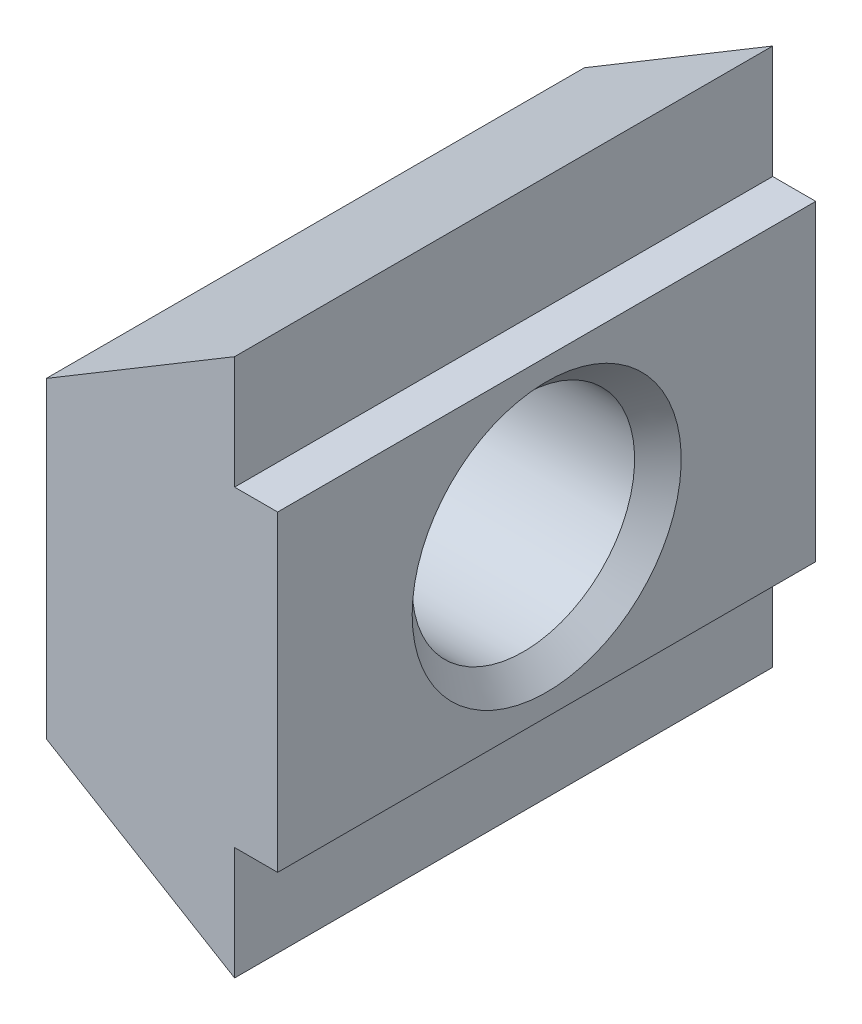
ISO-10303-21;
HEADER;
FILE_DESCRIPTION(('STEP AP214'),'2;1');
FILE_NAME('part.step','',(''),(''),'','','');
FILE_SCHEMA(('AUTOMOTIVE_DESIGN { 1 0 10303 214 1 1 1 1 }'));
ENDSEC;
DATA;
#1=APPLICATION_CONTEXT('core data for automotive mechanical design processes');
#2=APPLICATION_PROTOCOL_DEFINITION('international standard','automotive_design',2000,#1);
#3=PRODUCT_CONTEXT('',#1,'mechanical');
#4=PRODUCT('Part','Part','',(#3));
#5=PRODUCT_RELATED_PRODUCT_CATEGORY('part','',(#4));
#6=PRODUCT_DEFINITION_FORMATION('','',#4);
#7=PRODUCT_DEFINITION_CONTEXT('part definition',#1,'design');
#8=PRODUCT_DEFINITION('design','',#6,#7);
#9=PRODUCT_DEFINITION_SHAPE('','',#8);
#10=(LENGTH_UNIT() NAMED_UNIT(*) SI_UNIT(.MILLI.,.METRE.));
#11=(NAMED_UNIT(*) PLANE_ANGLE_UNIT() SI_UNIT($,.RADIAN.));
#12=(NAMED_UNIT(*) SI_UNIT($,.STERADIAN.) SOLID_ANGLE_UNIT());
#13=UNCERTAINTY_MEASURE_WITH_UNIT(LENGTH_MEASURE(1.E-05),#10,'distance_accuracy_value','');
#14=(GEOMETRIC_REPRESENTATION_CONTEXT(3) GLOBAL_UNCERTAINTY_ASSIGNED_CONTEXT((#13)) GLOBAL_UNIT_ASSIGNED_CONTEXT((#10,
#11,#12)) REPRESENTATION_CONTEXT('',''));
#15=CARTESIAN_POINT('',(0.,0.,0.));
#16=DIRECTION('',(0.,0.,1.));
#17=DIRECTION('',(1.,0.,0.));
#18=AXIS2_PLACEMENT_3D('',#15,#16,#17);
#19=CARTESIAN_POINT('',(-4.3,2.9,5.));
#20=DIRECTION('',(1.,0.,0.));
#21=DIRECTION('',(0.,0.,-1.));
#22=AXIS2_PLACEMENT_3D('',#19,#20,#21);
#23=PLANE('',#22);
#24=DIRECTION('',(0.,0.,-1.));
#25=VECTOR('',#24,1.);
#26=CARTESIAN_POINT('',(-4.3,2.9,5.));
#27=LINE('',#26,#25);
#28=CARTESIAN_POINT('',(-4.3,2.9,5.));
#29=VERTEX_POINT('',#28);
#30=CARTESIAN_POINT('',(-4.3,2.9,-5.));
#31=VERTEX_POINT('',#30);
#32=EDGE_CURVE('E11',#29,#31,#27,.T.);
#33=ORIENTED_EDGE('',*,*,#32,.T.);
#34=DIRECTION('',(0.,-1.,0.));
#35=VECTOR('',#34,1.);
#36=CARTESIAN_POINT('',(-4.3,2.9,-5.));
#37=LINE('',#36,#35);
#38=CARTESIAN_POINT('',(-4.3,-2.9,-5.));
#39=VERTEX_POINT('',#38);
#40=EDGE_CURVE('E107',#31,#39,#37,.T.);
#41=ORIENTED_EDGE('',*,*,#40,.T.);
#42=DIRECTION('',(0.,0.,-1.));
#43=VECTOR('',#42,1.);
#44=CARTESIAN_POINT('',(-4.3,-2.9,5.));
#45=LINE('',#44,#43);
#46=CARTESIAN_POINT('',(-4.3,-2.9,5.));
#47=VERTEX_POINT('',#46);
#48=EDGE_CURVE('E48',#47,#39,#45,.T.);
#49=ORIENTED_EDGE('',*,*,#48,.F.);
#50=DIRECTION('',(0.,-1.,0.));
#51=VECTOR('',#50,1.);
#52=CARTESIAN_POINT('',(-4.3,2.9,5.));
#53=LINE('',#52,#51);
#54=EDGE_CURVE('E108',#29,#47,#53,.T.);
#55=ORIENTED_EDGE('',*,*,#54,.F.);
#56=EDGE_LOOP('',(#33,#41,#49,#55));
#57=FACE_BOUND('',#56,.T.);
#58=CARTESIAN_POINT('',(-4.3,0.,0.));
#59=DIRECTION('',(-1.,0.,0.));
#60=DIRECTION('',(0.,0.,1.));
#61=AXIS2_PLACEMENT_3D('',#58,#59,#60);
#62=CIRCLE('',#61,2.5);
#63=CARTESIAN_POINT('',(-4.3,0.,2.5));
#64=VERTEX_POINT('',#63);
#65=EDGE_CURVE('E124',#64,#64,#62,.T.);
#66=ORIENTED_EDGE('',*,*,#65,.F.);
#67=EDGE_LOOP('',(#66));
#68=FACE_BOUND('',#67,.T.);
#69=ADVANCED_FACE('F40',(#57,#68),#23,.F.);
#70=CARTESIAN_POINT('',(0.,-2.9,5.));
#71=DIRECTION('',(-1.,0.,0.));
#72=DIRECTION('',(0.,0.,1.));
#73=AXIS2_PLACEMENT_3D('',#70,#71,#72);
#74=PLANE('',#73);
#75=DIRECTION('',(0.,0.,-1.));
#76=VECTOR('',#75,1.);
#77=CARTESIAN_POINT('',(0.,-2.9,5.));
#78=LINE('',#77,#76);
#79=CARTESIAN_POINT('',(0.,-2.9,5.));
#80=VERTEX_POINT('',#79);
#81=CARTESIAN_POINT('',(0.,-2.9,-5.));
#82=VERTEX_POINT('',#81);
#83=EDGE_CURVE('E164',#80,#82,#78,.T.);
#84=ORIENTED_EDGE('',*,*,#83,.T.);
#85=DIRECTION('',(0.,1.,0.));
#86=VECTOR('',#85,1.);
#87=CARTESIAN_POINT('',(0.,-2.9,-5.));
#88=LINE('',#87,#86);
#89=CARTESIAN_POINT('',(0.,2.9,-5.));
#90=VERTEX_POINT('',#89);
#91=EDGE_CURVE('E138',#82,#90,#88,.T.);
#92=ORIENTED_EDGE('',*,*,#91,.T.);
#93=DIRECTION('',(0.,0.,-1.));
#94=VECTOR('',#93,1.);
#95=CARTESIAN_POINT('',(0.,2.9,5.));
#96=LINE('',#95,#94);
#97=CARTESIAN_POINT('',(0.,2.9,5.));
#98=VERTEX_POINT('',#97);
#99=EDGE_CURVE('E162',#98,#90,#96,.T.);
#100=ORIENTED_EDGE('',*,*,#99,.F.);
#101=DIRECTION('',(0.,1.,0.));
#102=VECTOR('',#101,1.);
#103=CARTESIAN_POINT('',(0.,-2.9,5.));
#104=LINE('',#103,#102);
#105=EDGE_CURVE('E155',#80,#98,#104,.T.);
#106=ORIENTED_EDGE('',*,*,#105,.F.);
#107=EDGE_LOOP('',(#84,#92,#100,#106));
#108=FACE_BOUND('',#107,.T.);
#109=CARTESIAN_POINT('',(0.,0.,0.));
#110=DIRECTION('',(-1.,0.,0.));
#111=DIRECTION('',(0.,0.,1.));
#112=AXIS2_PLACEMENT_3D('',#109,#110,#111);
#113=CIRCLE('',#112,2.5);
#114=CARTESIAN_POINT('',(0.,0.,2.5));
#115=VERTEX_POINT('',#114);
#116=EDGE_CURVE('E285',#115,#115,#113,.T.);
#117=ORIENTED_EDGE('',*,*,#116,.T.);
#118=EDGE_LOOP('',(#117));
#119=FACE_BOUND('',#118,.T.);
#120=ADVANCED_FACE('F187',(#108,#119),#74,.F.);
#121=CARTESIAN_POINT('',(-0.8,5.,5.));
#122=DIRECTION('',(0.514495755427527,-0.857492925712544,0.));
#123=DIRECTION('',(0.857492925712544,0.514495755427527,0.));
#124=AXIS2_PLACEMENT_3D('',#121,#122,#123);
#125=PLANE('',#124);
#126=DIRECTION('',(0.,0.,-1.));
#127=VECTOR('',#126,1.);
#128=CARTESIAN_POINT('',(-0.8,5.,5.));
#129=LINE('',#128,#127);
#130=CARTESIAN_POINT('',(-0.8,5.,5.));
#131=VERTEX_POINT('',#130);
#132=CARTESIAN_POINT('',(-0.8,5.,-5.));
#133=VERTEX_POINT('',#132);
#134=EDGE_CURVE('E123',#131,#133,#129,.T.);
#135=ORIENTED_EDGE('',*,*,#134,.T.);
#136=DIRECTION('',(-0.857492925712544,-0.514495755427527,0.));
#137=VECTOR('',#136,1.);
#138=CARTESIAN_POINT('',(-0.8,5.,-5.));
#139=LINE('',#138,#137);
#140=EDGE_CURVE('E117',#133,#31,#139,.T.);
#141=ORIENTED_EDGE('',*,*,#140,.T.);
#142=ORIENTED_EDGE('',*,*,#32,.F.);
#143=DIRECTION('',(-0.857492925712544,-0.514495755427527,0.));
#144=VECTOR('',#143,1.);
#145=CARTESIAN_POINT('',(-0.8,5.,5.));
#146=LINE('',#145,#144);
#147=EDGE_CURVE('E146',#131,#29,#146,.T.);
#148=ORIENTED_EDGE('',*,*,#147,.F.);
#149=EDGE_LOOP('',(#135,#141,#142,#148));
#150=FACE_BOUND('',#149,.T.);
#151=ADVANCED_FACE('F42',(#150),#125,.F.);
#152=CARTESIAN_POINT('',(-4.3,-2.9,5.));
#153=DIRECTION('',(0.514495755427527,0.857492925712544,0.));
#154=DIRECTION('',(-0.857492925712544,0.514495755427527,0.));
#155=AXIS2_PLACEMENT_3D('',#152,#153,#154);
#156=PLANE('',#155);
#157=ORIENTED_EDGE('',*,*,#48,.T.);
#158=DIRECTION('',(0.857492925712544,-0.514495755427527,0.));
#159=VECTOR('',#158,1.);
#160=CARTESIAN_POINT('',(-4.3,-2.9,-5.));
#161=LINE('',#160,#159);
#162=CARTESIAN_POINT('',(-0.8,-5.,-5.));
#163=VERTEX_POINT('',#162);
#164=EDGE_CURVE('E121',#39,#163,#161,.T.);
#165=ORIENTED_EDGE('',*,*,#164,.T.);
#166=DIRECTION('',(0.,0.,-1.));
#167=VECTOR('',#166,1.);
#168=CARTESIAN_POINT('',(-0.8,-5.,5.));
#169=LINE('',#168,#167);
#170=CARTESIAN_POINT('',(-0.8,-5.,5.));
#171=VERTEX_POINT('',#170);
#172=EDGE_CURVE('E168',#171,#163,#169,.T.);
#173=ORIENTED_EDGE('',*,*,#172,.F.);
#174=DIRECTION('',(0.857492925712544,-0.514495755427527,0.));
#175=VECTOR('',#174,1.);
#176=CARTESIAN_POINT('',(-4.3,-2.9,5.));
#177=LINE('',#176,#175);
#178=EDGE_CURVE('E149',#47,#171,#177,.T.);
#179=ORIENTED_EDGE('',*,*,#178,.F.);
#180=EDGE_LOOP('',(#157,#165,#173,#179));
#181=FACE_BOUND('',#180,.T.);
#182=ADVANCED_FACE('F171',(#181),#156,.F.);
#183=CARTESIAN_POINT('',(-0.8,-5.,5.));
#184=DIRECTION('',(-1.,0.,0.));
#185=DIRECTION('',(0.,0.,1.));
#186=AXIS2_PLACEMENT_3D('',#183,#184,#185);
#187=PLANE('',#186);
#188=ORIENTED_EDGE('',*,*,#172,.T.);
#189=DIRECTION('',(0.,1.,0.));
#190=VECTOR('',#189,1.);
#191=CARTESIAN_POINT('',(-0.8,-5.,-5.));
#192=LINE('',#191,#190);
#193=CARTESIAN_POINT('',(-0.8,-2.9,-5.));
#194=VERTEX_POINT('',#193);
#195=EDGE_CURVE('E132',#163,#194,#192,.T.);
#196=ORIENTED_EDGE('',*,*,#195,.T.);
#197=DIRECTION('',(0.,0.,-1.));
#198=VECTOR('',#197,1.);
#199=CARTESIAN_POINT('',(-0.8,-2.9,5.));
#200=LINE('',#199,#198);
#201=CARTESIAN_POINT('',(-0.8,-2.9,5.));
#202=VERTEX_POINT('',#201);
#203=EDGE_CURVE('E166',#202,#194,#200,.T.);
#204=ORIENTED_EDGE('',*,*,#203,.F.);
#205=DIRECTION('',(0.,1.,0.));
#206=VECTOR('',#205,1.);
#207=CARTESIAN_POINT('',(-0.8,-5.,5.));
#208=LINE('',#207,#206);
#209=EDGE_CURVE('E151',#171,#202,#208,.T.);
#210=ORIENTED_EDGE('',*,*,#209,.F.);
#211=EDGE_LOOP('',(#188,#196,#204,#210));
#212=FACE_BOUND('',#211,.T.);
#213=ADVANCED_FACE('F179',(#212),#187,.F.);
#214=CARTESIAN_POINT('',(-0.8,-2.9,5.));
#215=DIRECTION('',(0.,1.,0.));
#216=DIRECTION('',(0.,0.,1.));
#217=AXIS2_PLACEMENT_3D('',#214,#215,#216);
#218=PLANE('',#217);
#219=ORIENTED_EDGE('',*,*,#203,.T.);
#220=DIRECTION('',(1.,0.,0.));
#221=VECTOR('',#220,1.);
#222=CARTESIAN_POINT('',(-0.8,-2.9,-5.));
#223=LINE('',#222,#221);
#224=EDGE_CURVE('E135',#194,#82,#223,.T.);
#225=ORIENTED_EDGE('',*,*,#224,.T.);
#226=ORIENTED_EDGE('',*,*,#83,.F.);
#227=DIRECTION('',(1.,0.,0.));
#228=VECTOR('',#227,1.);
#229=CARTESIAN_POINT('',(-0.8,-2.9,5.));
#230=LINE('',#229,#228);
#231=EDGE_CURVE('E153',#202,#80,#230,.T.);
#232=ORIENTED_EDGE('',*,*,#231,.F.);
#233=EDGE_LOOP('',(#219,#225,#226,#232));
#234=FACE_BOUND('',#233,.T.);
#235=ADVANCED_FACE('F182',(#234),#218,.F.);
#236=CARTESIAN_POINT('',(0.,2.9,5.));
#237=DIRECTION('',(0.,-1.,0.));
#238=DIRECTION('',(0.,0.,-1.));
#239=AXIS2_PLACEMENT_3D('',#236,#237,#238);
#240=PLANE('',#239);
#241=ORIENTED_EDGE('',*,*,#99,.T.);
#242=DIRECTION('',(-1.,0.,0.));
#243=VECTOR('',#242,1.);
#244=CARTESIAN_POINT('',(0.,2.9,-5.));
#245=LINE('',#244,#243);
#246=CARTESIAN_POINT('',(-0.8,2.9,-5.));
#247=VERTEX_POINT('',#246);
#248=EDGE_CURVE('E141',#90,#247,#245,.T.);
#249=ORIENTED_EDGE('',*,*,#248,.T.);
#250=DIRECTION('',(0.,0.,-1.));
#251=VECTOR('',#250,1.);
#252=CARTESIAN_POINT('',(-0.8,2.9,5.));
#253=LINE('',#252,#251);
#254=CARTESIAN_POINT('',(-0.8,2.9,5.));
#255=VERTEX_POINT('',#254);
#256=EDGE_CURVE('E160',#255,#247,#253,.T.);
#257=ORIENTED_EDGE('',*,*,#256,.F.);
#258=DIRECTION('',(-1.,0.,0.));
#259=VECTOR('',#258,1.);
#260=CARTESIAN_POINT('',(0.,2.9,5.));
#261=LINE('',#260,#259);
#262=EDGE_CURVE('E60',#98,#255,#261,.T.);
#263=ORIENTED_EDGE('',*,*,#262,.F.);
#264=EDGE_LOOP('',(#241,#249,#257,#263));
#265=FACE_BOUND('',#264,.T.);
#266=ADVANCED_FACE('F191',(#265),#240,.F.);
#267=CARTESIAN_POINT('',(-0.8,2.9,5.));
#268=DIRECTION('',(-1.,0.,0.));
#269=DIRECTION('',(0.,0.,1.));
#270=AXIS2_PLACEMENT_3D('',#267,#268,#269);
#271=PLANE('',#270);
#272=ORIENTED_EDGE('',*,*,#256,.T.);
#273=DIRECTION('',(0.,1.,0.));
#274=VECTOR('',#273,1.);
#275=CARTESIAN_POINT('',(-0.8,2.9,-5.));
#276=LINE('',#275,#274);
#277=EDGE_CURVE('E144',#247,#133,#276,.T.);
#278=ORIENTED_EDGE('',*,*,#277,.T.);
#279=ORIENTED_EDGE('',*,*,#134,.F.);
#280=DIRECTION('',(0.,1.,0.));
#281=VECTOR('',#280,1.);
#282=CARTESIAN_POINT('',(-0.8,2.9,5.));
#283=LINE('',#282,#281);
#284=EDGE_CURVE('E55',#255,#131,#283,.T.);
#285=ORIENTED_EDGE('',*,*,#284,.F.);
#286=EDGE_LOOP('',(#272,#278,#279,#285));
#287=FACE_BOUND('',#286,.T.);
#288=ADVANCED_FACE('F193',(#287),#271,.F.);
#289=CARTESIAN_POINT('',(0.,0.,5.));
#290=DIRECTION('',(0.,0.,1.));
#291=DIRECTION('',(1.,0.,0.));
#292=AXIS2_PLACEMENT_3D('',#289,#290,#291);
#293=PLANE('',#292);
#294=ORIENTED_EDGE('',*,*,#147,.T.);
#295=ORIENTED_EDGE('',*,*,#54,.T.);
#296=ORIENTED_EDGE('',*,*,#178,.T.);
#297=ORIENTED_EDGE('',*,*,#209,.T.);
#298=ORIENTED_EDGE('',*,*,#231,.T.);
#299=ORIENTED_EDGE('',*,*,#105,.T.);
#300=ORIENTED_EDGE('',*,*,#262,.T.);
#301=ORIENTED_EDGE('',*,*,#284,.T.);
#302=EDGE_LOOP('',(#294,#295,#296,#297,#298,#299,#300,#301));
#303=FACE_BOUND('',#302,.T.);
#304=ADVANCED_FACE('F174',(#303),#293,.T.);
#305=CARTESIAN_POINT('',(0.,0.,-5.));
#306=DIRECTION('',(0.,0.,1.));
#307=DIRECTION('',(1.,0.,0.));
#308=AXIS2_PLACEMENT_3D('',#305,#306,#307);
#309=PLANE('',#308);
#310=ORIENTED_EDGE('',*,*,#140,.F.);
#311=ORIENTED_EDGE('',*,*,#277,.F.);
#312=ORIENTED_EDGE('',*,*,#248,.F.);
#313=ORIENTED_EDGE('',*,*,#91,.F.);
#314=ORIENTED_EDGE('',*,*,#224,.F.);
#315=ORIENTED_EDGE('',*,*,#195,.F.);
#316=ORIENTED_EDGE('',*,*,#164,.F.);
#317=ORIENTED_EDGE('',*,*,#40,.F.);
#318=EDGE_LOOP('',(#310,#311,#312,#313,#314,#315,#316,#317));
#319=FACE_BOUND('',#318,.T.);
#320=ADVANCED_FACE('F115',(#319),#309,.F.);
#321=CARTESIAN_POINT('',(-3.867,0.,0.));
#322=DIRECTION('',(-1.,0.,0.));
#323=DIRECTION('',(0.,0.,1.));
#324=AXIS2_PLACEMENT_3D('',#321,#322,#323);
#325=CONICAL_SURFACE('',#324,2.067,0.785398163397449);
#326=ORIENTED_EDGE('',*,*,#65,.T.);
#327=EDGE_LOOP('',(#326));
#328=FACE_BOUND('',#327,.T.);
#329=CARTESIAN_POINT('',(-3.867,0.,0.));
#330=DIRECTION('',(-1.,0.,0.));
#331=DIRECTION('',(0.,0.,1.));
#332=AXIS2_PLACEMENT_3D('',#329,#330,#331);
#333=CIRCLE('',#332,2.067);
#334=CARTESIAN_POINT('',(-3.867,0.,2.067));
#335=VERTEX_POINT('',#334);
#336=EDGE_CURVE('E127',#335,#335,#333,.T.);
#337=ORIENTED_EDGE('',*,*,#336,.F.);
#338=EDGE_LOOP('',(#337));
#339=FACE_BOUND('',#338,.T.);
#340=ADVANCED_FACE('F242',(#328,#339),#325,.F.);
#341=CARTESIAN_POINT('',(0.,0.,0.));
#342=DIRECTION('',(-1.,0.,0.));
#343=DIRECTION('',(0.,0.,1.));
#344=AXIS2_PLACEMENT_3D('',#341,#342,#343);
#345=CYLINDRICAL_SURFACE('',#344,2.067);
#346=ORIENTED_EDGE('',*,*,#336,.T.);
#347=EDGE_LOOP('',(#346));
#348=FACE_BOUND('',#347,.T.);
#349=CARTESIAN_POINT('',(-0.432999999999999,0.,0.));
#350=DIRECTION('',(-1.,0.,0.));
#351=DIRECTION('',(0.,0.,1.));
#352=AXIS2_PLACEMENT_3D('',#349,#350,#351);
#353=CIRCLE('',#352,2.067);
#354=CARTESIAN_POINT('',(-0.432999999999999,0.,2.067));
#355=VERTEX_POINT('',#354);
#356=EDGE_CURVE('E282',#355,#355,#353,.T.);
#357=ORIENTED_EDGE('',*,*,#356,.F.);
#358=EDGE_LOOP('',(#357));
#359=FACE_BOUND('',#358,.T.);
#360=ADVANCED_FACE('F252',(#348,#359),#345,.F.);
#361=CARTESIAN_POINT('',(0.,0.,0.));
#362=DIRECTION('',(1.,0.,0.));
#363=DIRECTION('',(0.,0.,-1.));
#364=AXIS2_PLACEMENT_3D('',#361,#362,#363);
#365=CONICAL_SURFACE('',#364,2.5,0.785398163397449);
#366=ORIENTED_EDGE('',*,*,#356,.T.);
#367=EDGE_LOOP('',(#366));
#368=FACE_BOUND('',#367,.T.);
#369=ORIENTED_EDGE('',*,*,#116,.F.);
#370=EDGE_LOOP('',(#369));
#371=FACE_BOUND('',#370,.T.);
#372=ADVANCED_FACE('F264',(#368,#371),#365,.F.);
#373=CLOSED_SHELL('',(#69,#120,#151,#182,#213,#235,#266,#288,#304,#320,#340,#360,#372));
#374=MANIFOLD_SOLID_BREP('B2',#373);
#375=ADVANCED_BREP_SHAPE_REPRESENTATION('',(#18,#374),#14);
#376=SHAPE_DEFINITION_REPRESENTATION(#9,#375);
ENDSEC;
END-ISO-10303-21;
